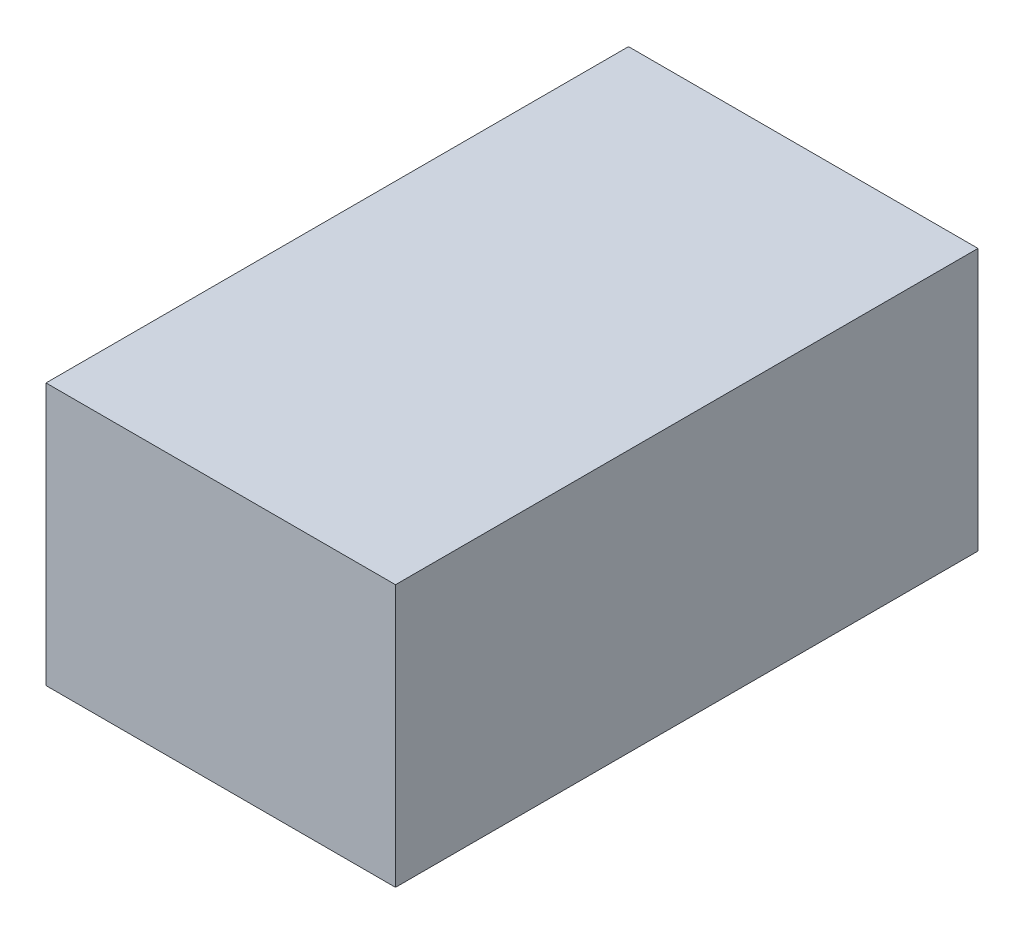
ISO-10303-21;
HEADER;
FILE_DESCRIPTION(('STEP AP214'),'2;1');
FILE_NAME('part.step','',(''),(''),'','','');
FILE_SCHEMA(('AUTOMOTIVE_DESIGN { 1 0 10303 214 1 1 1 1 }'));
ENDSEC;
DATA;
#1=APPLICATION_CONTEXT('core data for automotive mechanical design processes');
#2=APPLICATION_PROTOCOL_DEFINITION('international standard','automotive_design',2000,#1);
#3=PRODUCT_CONTEXT('',#1,'mechanical');
#4=PRODUCT('Part','Part','',(#3));
#5=PRODUCT_RELATED_PRODUCT_CATEGORY('part','',(#4));
#6=PRODUCT_DEFINITION_FORMATION('','',#4);
#7=PRODUCT_DEFINITION_CONTEXT('part definition',#1,'design');
#8=PRODUCT_DEFINITION('design','',#6,#7);
#9=PRODUCT_DEFINITION_SHAPE('','',#8);
#10=(LENGTH_UNIT() NAMED_UNIT(*) SI_UNIT(.MILLI.,.METRE.));
#11=(NAMED_UNIT(*) PLANE_ANGLE_UNIT() SI_UNIT($,.RADIAN.));
#12=(NAMED_UNIT(*) SI_UNIT($,.STERADIAN.) SOLID_ANGLE_UNIT());
#13=UNCERTAINTY_MEASURE_WITH_UNIT(LENGTH_MEASURE(1.E-05),#10,'distance_accuracy_value','');
#14=(GEOMETRIC_REPRESENTATION_CONTEXT(3) GLOBAL_UNCERTAINTY_ASSIGNED_CONTEXT((#13)) GLOBAL_UNIT_ASSIGNED_CONTEXT((#10,
#11,#12)) REPRESENTATION_CONTEXT('',''));
#15=CARTESIAN_POINT('',(0.,0.,0.));
#16=DIRECTION('',(0.,0.,1.));
#17=DIRECTION('',(1.,0.,0.));
#18=AXIS2_PLACEMENT_3D('',#15,#16,#17);
#19=CARTESIAN_POINT('',(0.,18.5,0.));
#20=DIRECTION('',(0.,-1.,0.));
#21=DIRECTION('',(0.,0.,-1.));
#22=AXIS2_PLACEMENT_3D('',#19,#20,#21);
#23=PLANE('',#22);
#24=DIRECTION('',(0.,0.,1.));
#25=VECTOR('',#24,1.);
#26=CARTESIAN_POINT('',(27.,18.5,-5.));
#27=LINE('',#26,#25);
#28=CARTESIAN_POINT('',(27.,18.5,-5.));
#29=VERTEX_POINT('',#28);
#30=CARTESIAN_POINT('',(27.,18.5,5.));
#31=VERTEX_POINT('',#30);
#32=EDGE_CURVE('E101',#29,#31,#27,.T.);
#33=ORIENTED_EDGE('',*,*,#32,.F.);
#34=DIRECTION('',(-1.,0.,0.));
#35=VECTOR('',#34,1.);
#36=CARTESIAN_POINT('',(27.,18.5,-5.));
#37=LINE('',#36,#35);
#38=CARTESIAN_POINT('',(33.,18.5,-5.));
#39=VERTEX_POINT('',#38);
#40=EDGE_CURVE('E90',#39,#29,#37,.T.);
#41=ORIENTED_EDGE('',*,*,#40,.F.);
#42=DIRECTION('',(0.,0.,-1.));
#43=VECTOR('',#42,1.);
#44=CARTESIAN_POINT('',(33.,18.5,-5.));
#45=LINE('',#44,#43);
#46=CARTESIAN_POINT('',(33.,18.5,5.));
#47=VERTEX_POINT('',#46);
#48=EDGE_CURVE('E45',#47,#39,#45,.T.);
#49=ORIENTED_EDGE('',*,*,#48,.F.);
#50=DIRECTION('',(1.,0.,0.));
#51=VECTOR('',#50,1.);
#52=CARTESIAN_POINT('',(27.,18.5,5.));
#53=LINE('',#52,#51);
#54=EDGE_CURVE('E88',#31,#47,#53,.T.);
#55=ORIENTED_EDGE('',*,*,#54,.F.);
#56=EDGE_LOOP('',(#33,#41,#49,#55));
#57=FACE_BOUND('',#56,.T.);
#58=ADVANCED_FACE('F42',(#57),#23,.T.);
#59=CARTESIAN_POINT('',(27.,18.5,-5.));
#60=DIRECTION('',(0.,0.,-1.));
#61=DIRECTION('',(-1.,0.,0.));
#62=AXIS2_PLACEMENT_3D('',#59,#60,#61);
#63=PLANE('',#62);
#64=DIRECTION('',(0.,1.,0.));
#65=VECTOR('',#64,1.);
#66=CARTESIAN_POINT('',(27.,18.5,-5.));
#67=LINE('',#66,#65);
#68=CARTESIAN_POINT('',(27.,23.,-5.));
#69=VERTEX_POINT('',#68);
#70=EDGE_CURVE('E66',#29,#69,#67,.T.);
#71=ORIENTED_EDGE('',*,*,#70,.T.);
#72=DIRECTION('',(-1.,0.,0.));
#73=VECTOR('',#72,1.);
#74=CARTESIAN_POINT('',(27.,23.,-5.));
#75=LINE('',#74,#73);
#76=CARTESIAN_POINT('',(33.,23.,-5.));
#77=VERTEX_POINT('',#76);
#78=EDGE_CURVE('E51',#77,#69,#75,.T.);
#79=ORIENTED_EDGE('',*,*,#78,.F.);
#80=DIRECTION('',(0.,1.,0.));
#81=VECTOR('',#80,1.);
#82=CARTESIAN_POINT('',(33.,18.5,-5.));
#83=LINE('',#82,#81);
#84=EDGE_CURVE('E59',#39,#77,#83,.T.);
#85=ORIENTED_EDGE('',*,*,#84,.F.);
#86=ORIENTED_EDGE('',*,*,#40,.T.);
#87=EDGE_LOOP('',(#71,#79,#85,#86));
#88=FACE_BOUND('',#87,.T.);
#89=ADVANCED_FACE('F120',(#88),#63,.T.);
#90=CARTESIAN_POINT('',(0.,23.,0.));
#91=DIRECTION('',(0.,1.,0.));
#92=DIRECTION('',(0.,0.,1.));
#93=AXIS2_PLACEMENT_3D('',#90,#91,#92);
#94=PLANE('',#93);
#95=DIRECTION('',(0.,0.,-1.));
#96=VECTOR('',#95,1.);
#97=CARTESIAN_POINT('',(33.,23.,-5.));
#98=LINE('',#97,#96);
#99=CARTESIAN_POINT('',(33.,23.,5.));
#100=VERTEX_POINT('',#99);
#101=EDGE_CURVE('E12',#100,#77,#98,.T.);
#102=ORIENTED_EDGE('',*,*,#101,.T.);
#103=ORIENTED_EDGE('',*,*,#78,.T.);
#104=DIRECTION('',(0.,0.,1.));
#105=VECTOR('',#104,1.);
#106=CARTESIAN_POINT('',(27.,23.,-5.));
#107=LINE('',#106,#105);
#108=CARTESIAN_POINT('',(27.,23.,5.));
#109=VERTEX_POINT('',#108);
#110=EDGE_CURVE('E112',#69,#109,#107,.T.);
#111=ORIENTED_EDGE('',*,*,#110,.T.);
#112=DIRECTION('',(1.,0.,0.));
#113=VECTOR('',#112,1.);
#114=CARTESIAN_POINT('',(27.,23.,5.));
#115=LINE('',#114,#113);
#116=EDGE_CURVE('E93',#109,#100,#115,.T.);
#117=ORIENTED_EDGE('',*,*,#116,.T.);
#118=EDGE_LOOP('',(#102,#103,#111,#117));
#119=FACE_BOUND('',#118,.T.);
#120=ADVANCED_FACE('F128',(#119),#94,.T.);
#121=CARTESIAN_POINT('',(27.,18.5,5.));
#122=DIRECTION('',(0.,0.,1.));
#123=DIRECTION('',(1.,0.,0.));
#124=AXIS2_PLACEMENT_3D('',#121,#122,#123);
#125=PLANE('',#124);
#126=DIRECTION('',(0.,1.,0.));
#127=VECTOR('',#126,1.);
#128=CARTESIAN_POINT('',(33.,18.5,5.));
#129=LINE('',#128,#127);
#130=EDGE_CURVE('E97',#47,#100,#129,.T.);
#131=ORIENTED_EDGE('',*,*,#130,.T.);
#132=ORIENTED_EDGE('',*,*,#116,.F.);
#133=DIRECTION('',(0.,1.,0.));
#134=VECTOR('',#133,1.);
#135=CARTESIAN_POINT('',(27.,18.5,5.));
#136=LINE('',#135,#134);
#137=EDGE_CURVE('E99',#31,#109,#136,.T.);
#138=ORIENTED_EDGE('',*,*,#137,.F.);
#139=ORIENTED_EDGE('',*,*,#54,.T.);
#140=EDGE_LOOP('',(#131,#132,#138,#139));
#141=FACE_BOUND('',#140,.T.);
#142=ADVANCED_FACE('F95',(#141),#125,.T.);
#143=CARTESIAN_POINT('',(27.,20.,-2.4));
#144=DIRECTION('',(1.,0.,0.));
#145=DIRECTION('',(0.,0.,-1.));
#146=AXIS2_PLACEMENT_3D('',#143,#144,#145);
#147=PLANE('',#146);
#148=ORIENTED_EDGE('',*,*,#70,.F.);
#149=ORIENTED_EDGE('',*,*,#32,.T.);
#150=ORIENTED_EDGE('',*,*,#137,.T.);
#151=ORIENTED_EDGE('',*,*,#110,.F.);
#152=EDGE_LOOP('',(#148,#149,#150,#151));
#153=FACE_BOUND('',#152,.T.);
#154=ADVANCED_FACE('F123',(#153),#147,.F.);
#155=CARTESIAN_POINT('',(33.,20.,-2.4));
#156=DIRECTION('',(-1.,0.,0.));
#157=DIRECTION('',(0.,0.,1.));
#158=AXIS2_PLACEMENT_3D('',#155,#156,#157);
#159=PLANE('',#158);
#160=ORIENTED_EDGE('',*,*,#130,.F.);
#161=ORIENTED_EDGE('',*,*,#48,.T.);
#162=ORIENTED_EDGE('',*,*,#84,.T.);
#163=ORIENTED_EDGE('',*,*,#101,.F.);
#164=EDGE_LOOP('',(#160,#161,#162,#163));
#165=FACE_BOUND('',#164,.T.);
#166=ADVANCED_FACE('F103',(#165),#159,.F.);
#167=CLOSED_SHELL('',(#58,#89,#120,#142,#154,#166));
#168=MANIFOLD_SOLID_BREP('B2',#167);
#169=ADVANCED_BREP_SHAPE_REPRESENTATION('',(#18,#168),#14);
#170=SHAPE_DEFINITION_REPRESENTATION(#9,#169);
ENDSEC;
END-ISO-10303-21;
